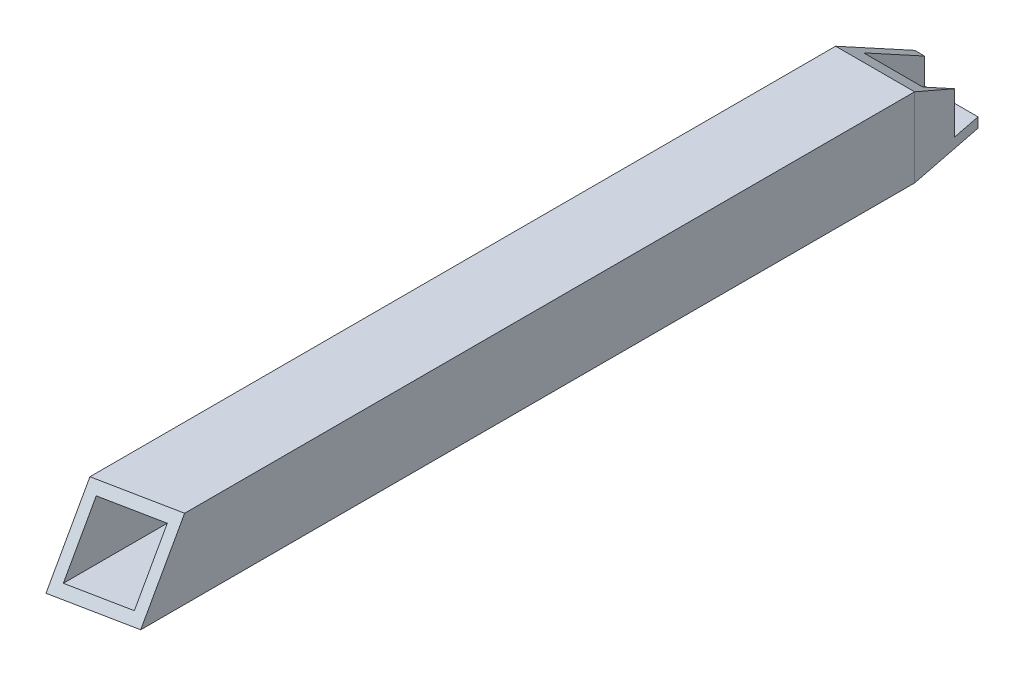
ISO-10303-21;
HEADER;
FILE_DESCRIPTION(('STEP AP214'),'2;1');
FILE_NAME('part.step','',(''),(''),'','','');
FILE_SCHEMA(('AUTOMOTIVE_DESIGN { 1 0 10303 214 1 1 1 1 }'));
ENDSEC;
DATA;
#1=APPLICATION_CONTEXT('core data for automotive mechanical design processes');
#2=APPLICATION_PROTOCOL_DEFINITION('international standard','automotive_design',2000,#1);
#3=PRODUCT_CONTEXT('',#1,'mechanical');
#4=PRODUCT('Part','Part','',(#3));
#5=PRODUCT_RELATED_PRODUCT_CATEGORY('part','',(#4));
#6=PRODUCT_DEFINITION_FORMATION('','',#4);
#7=PRODUCT_DEFINITION_CONTEXT('part definition',#1,'design');
#8=PRODUCT_DEFINITION('design','',#6,#7);
#9=PRODUCT_DEFINITION_SHAPE('','',#8);
#10=(LENGTH_UNIT() NAMED_UNIT(*) SI_UNIT(.MILLI.,.METRE.));
#11=(NAMED_UNIT(*) PLANE_ANGLE_UNIT() SI_UNIT($,.RADIAN.));
#12=(NAMED_UNIT(*) SI_UNIT($,.STERADIAN.) SOLID_ANGLE_UNIT());
#13=UNCERTAINTY_MEASURE_WITH_UNIT(LENGTH_MEASURE(1.E-05),#10,'distance_accuracy_value','');
#14=(GEOMETRIC_REPRESENTATION_CONTEXT(3) GLOBAL_UNCERTAINTY_ASSIGNED_CONTEXT((#13)) GLOBAL_UNIT_ASSIGNED_CONTEXT((#10,
#11,#12)) REPRESENTATION_CONTEXT('',''));
#15=CARTESIAN_POINT('',(0.,0.,0.));
#16=DIRECTION('',(0.,0.,1.));
#17=DIRECTION('',(1.,0.,0.));
#18=AXIS2_PLACEMENT_3D('',#15,#16,#17);
#19=CARTESIAN_POINT('',(12.7,-12.7,139.7));
#20=DIRECTION('',(-1.,0.,0.));
#21=DIRECTION('',(0.,0.,1.));
#22=AXIS2_PLACEMENT_3D('',#19,#20,#21);
#23=PLANE('',#22);
#24=DIRECTION('',(0.,-0.478845087585913,-0.877899414565723));
#25=VECTOR('',#24,1.);
#26=CARTESIAN_POINT('',(12.7,113.632615657703,70.7926156164541));
#27=LINE('',#26,#25);
#28=CARTESIAN_POINT('',(12.7,12.7,-114.254044553338));
#29=VERTEX_POINT('',#28);
#30=CARTESIAN_POINT('',(12.7,12.6749338711053,-114.3));
#31=VERTEX_POINT('',#30);
#32=EDGE_CURVE('E58',#29,#31,#27,.T.);
#33=ORIENTED_EDGE('',*,*,#32,.F.);
#34=DIRECTION('',(0.,0.,-1.));
#35=VECTOR('',#34,1.);
#36=CARTESIAN_POINT('',(12.7,12.7,139.7));
#37=LINE('',#36,#35);
#38=CARTESIAN_POINT('',(12.7,12.7,120.516824075556));
#39=VERTEX_POINT('',#38);
#40=EDGE_CURVE('E216',#39,#29,#37,.T.);
#41=ORIENTED_EDGE('',*,*,#40,.F.);
#42=DIRECTION('',(0.,0.873936887721125,-0.486039418442901));
#43=VECTOR('',#42,1.);
#44=CARTESIAN_POINT('',(12.7,-14.8480433532563,135.837650051412));
#45=LINE('',#44,#43);
#46=CARTESIAN_POINT('',(12.7,-12.7,134.643017170164));
#47=VERTEX_POINT('',#46);
#48=EDGE_CURVE('E173',#47,#39,#45,.T.);
#49=ORIENTED_EDGE('',*,*,#48,.F.);
#50=DIRECTION('',(0.,0.,-1.));
#51=VECTOR('',#50,1.);
#52=CARTESIAN_POINT('',(12.7,-12.7,139.7));
#53=LINE('',#52,#51);
#54=CARTESIAN_POINT('',(12.7,-12.7,-114.3));
#55=VERTEX_POINT('',#54);
#56=EDGE_CURVE('E220',#47,#55,#53,.T.);
#57=ORIENTED_EDGE('',*,*,#56,.T.);
#58=DIRECTION('',(0.,-1.,0.));
#59=VECTOR('',#58,1.);
#60=CARTESIAN_POINT('',(12.7,-12.7,-114.3));
#61=LINE('',#60,#59);
#62=EDGE_CURVE('E64',#31,#55,#61,.T.);
#63=ORIENTED_EDGE('',*,*,#62,.F.);
#64=EDGE_LOOP('',(#33,#41,#49,#57,#63));
#65=FACE_BOUND('',#64,.T.);
#66=ADVANCED_FACE('F42',(#65),#23,.F.);
#67=CARTESIAN_POINT('',(12.7,12.7,139.7));
#68=DIRECTION('',(0.,-1.,0.));
#69=DIRECTION('',(0.,0.,-1.));
#70=AXIS2_PLACEMENT_3D('',#67,#68,#69);
#71=PLANE('',#70);
#72=DIRECTION('',(1.,0.,0.));
#73=VECTOR('',#72,1.);
#74=CARTESIAN_POINT('',(12.7,12.7,-114.254044553338));
#75=LINE('',#74,#73);
#76=CARTESIAN_POINT('',(-12.7,12.7,-114.254044553338));
#77=VERTEX_POINT('',#76);
#78=EDGE_CURVE('E256',#77,#29,#75,.T.);
#79=ORIENTED_EDGE('',*,*,#78,.F.);
#80=DIRECTION('',(0.,0.,-1.));
#81=VECTOR('',#80,1.);
#82=CARTESIAN_POINT('',(-12.7,12.7,139.7));
#83=LINE('',#82,#81);
#84=CARTESIAN_POINT('',(-12.7,12.7,125.573806905392));
#85=VERTEX_POINT('',#84);
#86=EDGE_CURVE('E212',#85,#77,#83,.T.);
#87=ORIENTED_EDGE('',*,*,#86,.F.);
#88=DIRECTION('',(-0.98075121578061,0.,0.195261498367845));
#89=VECTOR('',#88,1.);
#90=CARTESIAN_POINT('',(9.0263651832796,12.7,121.248222035841));
#91=LINE('',#90,#89);
#92=EDGE_CURVE('E169',#39,#85,#91,.T.);
#93=ORIENTED_EDGE('',*,*,#92,.F.);
#94=ORIENTED_EDGE('',*,*,#40,.T.);
#95=EDGE_LOOP('',(#79,#87,#93,#94));
#96=FACE_BOUND('',#95,.T.);
#97=ADVANCED_FACE('F250',(#96),#71,.F.);
#98=CARTESIAN_POINT('',(9.525,-9.525,139.7));
#99=DIRECTION('',(-1.,0.,0.));
#100=DIRECTION('',(0.,0.,1.));
#101=AXIS2_PLACEMENT_3D('',#98,#99,#100);
#102=PLANE('',#101);
#103=DIRECTION('',(0.,0.,-1.));
#104=VECTOR('',#103,1.);
#105=CARTESIAN_POINT('',(9.525,9.525,139.7));
#106=LINE('',#105,#104);
#107=CARTESIAN_POINT('',(9.525,9.525,122.914721066111));
#108=VERTEX_POINT('',#107);
#109=CARTESIAN_POINT('',(9.525,9.52500000000002,-120.074988974629));
#110=VERTEX_POINT('',#109);
#111=EDGE_CURVE('E136',#108,#110,#106,.T.);
#112=ORIENTED_EDGE('',*,*,#111,.T.);
#113=DIRECTION('',(0.,-0.478845087585913,-0.877899414565723));
#114=VECTOR('',#113,1.);
#115=CARTESIAN_POINT('',(9.525,114.360619719552,72.1273152014925));
#116=LINE('',#115,#114);
#117=CARTESIAN_POINT('',(9.525,3.97659657792252,-130.247256044493));
#118=VERTEX_POINT('',#117);
#119=EDGE_CURVE('E125',#110,#118,#116,.T.);
#120=ORIENTED_EDGE('',*,*,#119,.T.);
#121=DIRECTION('',(0.,-1.,0.));
#122=VECTOR('',#121,1.);
#123=CARTESIAN_POINT('',(9.525,-9.525,-130.247256044493));
#124=LINE('',#123,#122);
#125=CARTESIAN_POINT('',(9.525,-9.525,-130.247256044493));
#126=VERTEX_POINT('',#125);
#127=EDGE_CURVE('E132',#118,#126,#124,.T.);
#128=ORIENTED_EDGE('',*,*,#127,.T.);
#129=DIRECTION('',(0.,0.,-1.));
#130=VECTOR('',#129,1.);
#131=CARTESIAN_POINT('',(9.525,-9.525,139.7));
#132=LINE('',#131,#130);
#133=CARTESIAN_POINT('',(9.525,-9.525,133.509365887067));
#134=VERTEX_POINT('',#133);
#135=EDGE_CURVE('E205',#134,#126,#132,.T.);
#136=ORIENTED_EDGE('',*,*,#135,.F.);
#137=DIRECTION('',(0.,0.873936887721125,-0.486039418442901));
#138=VECTOR('',#137,1.);
#139=CARTESIAN_POINT('',(9.525,-12.1545818882893,134.971806104078));
#140=LINE('',#139,#138);
#141=EDGE_CURVE('E158',#134,#108,#140,.T.);
#142=ORIENTED_EDGE('',*,*,#141,.T.);
#143=EDGE_LOOP('',(#112,#120,#128,#136,#142));
#144=FACE_BOUND('',#143,.T.);
#145=ADVANCED_FACE('F130',(#144),#102,.T.);
#146=CARTESIAN_POINT('',(9.525,9.525,139.7));
#147=DIRECTION('',(0.,-1.,0.));
#148=DIRECTION('',(0.,0.,-1.));
#149=AXIS2_PLACEMENT_3D('',#146,#147,#148);
#150=PLANE('',#149);
#151=DIRECTION('',(0.,0.,-1.));
#152=VECTOR('',#151,1.);
#153=CARTESIAN_POINT('',(-9.52499999999999,9.525,139.7));
#154=LINE('',#153,#152);
#155=CARTESIAN_POINT('',(-9.52499999999999,9.525,126.707458188488));
#156=VERTEX_POINT('',#155);
#157=CARTESIAN_POINT('',(-9.52499999999999,9.525,-120.074988974629));
#158=VERTEX_POINT('',#157);
#159=EDGE_CURVE('E199',#156,#158,#154,.T.);
#160=ORIENTED_EDGE('',*,*,#159,.T.);
#161=DIRECTION('',(1.,0.,0.));
#162=VECTOR('',#161,1.);
#163=CARTESIAN_POINT('',(9.525,9.525,-120.074988974629));
#164=LINE('',#163,#162);
#165=EDGE_CURVE('E253',#158,#110,#164,.T.);
#166=ORIENTED_EDGE('',*,*,#165,.T.);
#167=ORIENTED_EDGE('',*,*,#111,.F.);
#168=DIRECTION('',(-0.98075121578061,0.,0.195261498367845));
#169=VECTOR('',#168,1.);
#170=CARTESIAN_POINT('',(6.31056953536965,9.525,123.554694281361));
#171=LINE('',#170,#169);
#172=EDGE_CURVE('E228',#108,#156,#171,.T.);
#173=ORIENTED_EDGE('',*,*,#172,.T.);
#174=EDGE_LOOP('',(#160,#166,#167,#173));
#175=FACE_BOUND('',#174,.T.);
#176=ADVANCED_FACE('F274',(#175),#150,.T.);
#177=CARTESIAN_POINT('',(0.,0.,-139.7));
#178=DIRECTION('',(0.,0.,1.));
#179=DIRECTION('',(1.,0.,0.));
#180=AXIS2_PLACEMENT_3D('',#177,#178,#179);
#181=PLANE('',#180);
#182=DIRECTION('',(-1.,0.,0.));
#183=VECTOR('',#182,1.);
#184=CARTESIAN_POINT('',(0.,-1.1793471807835,-139.7));
#185=LINE('',#184,#183);
#186=CARTESIAN_POINT('',(-9.52499999999999,-1.1793471807835,-139.7));
#187=VERTEX_POINT('',#186);
#188=CARTESIAN_POINT('',(-12.7,-1.1793471807835,-139.7));
#189=VERTEX_POINT('',#188);
#190=EDGE_CURVE('E144',#187,#189,#185,.T.);
#191=ORIENTED_EDGE('',*,*,#190,.F.);
#192=DIRECTION('',(0.,-1.,0.));
#193=VECTOR('',#192,1.);
#194=CARTESIAN_POINT('',(-9.52499999999999,-9.525,-139.7));
#195=LINE('',#194,#193);
#196=CARTESIAN_POINT('',(-9.52499999999999,-9.525,-139.7));
#197=VERTEX_POINT('',#196);
#198=EDGE_CURVE('E185',#187,#197,#195,.T.);
#199=ORIENTED_EDGE('',*,*,#198,.T.);
#200=DIRECTION('',(1.,0.,0.));
#201=VECTOR('',#200,1.);
#202=CARTESIAN_POINT('',(9.525,-9.525,-139.7));
#203=LINE('',#202,#201);
#204=CARTESIAN_POINT('',(7.64301717016406,-9.525,-139.7));
#205=VERTEX_POINT('',#204);
#206=EDGE_CURVE('E188',#197,#205,#203,.T.);
#207=ORIENTED_EDGE('',*,*,#206,.T.);
#208=DIRECTION('',(0.,1.,0.));
#209=VECTOR('',#208,1.);
#210=CARTESIAN_POINT('',(7.64301717016406,0.,-139.7));
#211=LINE('',#210,#209);
#212=CARTESIAN_POINT('',(7.64301717016406,-12.7,-139.7));
#213=VERTEX_POINT('',#212);
#214=EDGE_CURVE('E51',#213,#205,#211,.T.);
#215=ORIENTED_EDGE('',*,*,#214,.F.);
#216=DIRECTION('',(1.,0.,0.));
#217=VECTOR('',#216,1.);
#218=CARTESIAN_POINT('',(12.7,-12.7,-139.7));
#219=LINE('',#218,#217);
#220=CARTESIAN_POINT('',(-12.7,-12.7,-139.7));
#221=VERTEX_POINT('',#220);
#222=EDGE_CURVE('E195',#221,#213,#219,.T.);
#223=ORIENTED_EDGE('',*,*,#222,.F.);
#224=DIRECTION('',(0.,-1.,0.));
#225=VECTOR('',#224,1.);
#226=CARTESIAN_POINT('',(-12.7,-12.7,-139.7));
#227=LINE('',#226,#225);
#228=EDGE_CURVE('E192',#189,#221,#227,.T.);
#229=ORIENTED_EDGE('',*,*,#228,.F.);
#230=EDGE_LOOP('',(#191,#199,#207,#215,#223,#229));
#231=FACE_BOUND('',#230,.T.);
#232=ADVANCED_FACE('F235',(#231),#181,.F.);
#233=CARTESIAN_POINT('',(-12.7,-12.7,139.7));
#234=DIRECTION('',(1.,0.,0.));
#235=DIRECTION('',(0.,0.,-1.));
#236=AXIS2_PLACEMENT_3D('',#233,#234,#235);
#237=PLANE('',#236);
#238=DIRECTION('',(0.,0.478845087585913,0.877899414565723));
#239=VECTOR('',#238,1.);
#240=CARTESIAN_POINT('',(-12.7,113.632615657703,70.7926156164541));
#241=LINE('',#240,#239);
#242=EDGE_CURVE('E149',#189,#77,#241,.T.);
#243=ORIENTED_EDGE('',*,*,#242,.F.);
#244=ORIENTED_EDGE('',*,*,#228,.T.);
#245=DIRECTION('',(0.,0.,-1.));
#246=VECTOR('',#245,1.);
#247=CARTESIAN_POINT('',(-12.7,-12.7,139.7));
#248=LINE('',#247,#246);
#249=CARTESIAN_POINT('',(-12.7,-12.7,139.7));
#250=VERTEX_POINT('',#249);
#251=EDGE_CURVE('E224',#250,#221,#248,.T.);
#252=ORIENTED_EDGE('',*,*,#251,.F.);
#253=DIRECTION('',(0.,-0.873936887721125,0.486039418442901));
#254=VECTOR('',#253,1.);
#255=CARTESIAN_POINT('',(-12.7,-12.7,139.7));
#256=LINE('',#255,#254);
#257=EDGE_CURVE('E181',#85,#250,#256,.T.);
#258=ORIENTED_EDGE('',*,*,#257,.F.);
#259=ORIENTED_EDGE('',*,*,#86,.T.);
#260=EDGE_LOOP('',(#243,#244,#252,#258,#259));
#261=FACE_BOUND('',#260,.T.);
#262=ADVANCED_FACE('F44',(#261),#237,.F.);
#263=CARTESIAN_POINT('',(-9.52499999999999,-9.525,139.7));
#264=DIRECTION('',(1.,0.,0.));
#265=DIRECTION('',(0.,0.,-1.));
#266=AXIS2_PLACEMENT_3D('',#263,#264,#265);
#267=PLANE('',#266);
#268=ORIENTED_EDGE('',*,*,#198,.F.);
#269=DIRECTION('',(0.,0.478845087585913,0.877899414565723));
#270=VECTOR('',#269,1.);
#271=CARTESIAN_POINT('',(-9.52499999999999,114.360619719552,72.1273152014925));
#272=LINE('',#271,#270);
#273=EDGE_CURVE('E261',#187,#158,#272,.T.);
#274=ORIENTED_EDGE('',*,*,#273,.T.);
#275=ORIENTED_EDGE('',*,*,#159,.F.);
#276=DIRECTION('',(0.,-0.873936887721125,0.486039418442901));
#277=VECTOR('',#276,1.);
#278=CARTESIAN_POINT('',(-9.52499999999999,-10.543549373347,137.868568565519));
#279=LINE('',#278,#277);
#280=CARTESIAN_POINT('',(-9.525,-9.525,137.302103009444));
#281=VERTEX_POINT('',#280);
#282=EDGE_CURVE('E165',#156,#281,#279,.T.);
#283=ORIENTED_EDGE('',*,*,#282,.T.);
#284=DIRECTION('',(0.,0.,-1.));
#285=VECTOR('',#284,1.);
#286=CARTESIAN_POINT('',(-9.52499999999999,-9.525,139.7));
#287=LINE('',#286,#285);
#288=EDGE_CURVE('E208',#281,#197,#287,.T.);
#289=ORIENTED_EDGE('',*,*,#288,.T.);
#290=EDGE_LOOP('',(#268,#274,#275,#283,#289));
#291=FACE_BOUND('',#290,.T.);
#292=ADVANCED_FACE('F267',(#291),#267,.T.);
#293=CARTESIAN_POINT('',(34.1045738345287,0.,-6.79000961811353));
#294=DIRECTION('',(0.98075121578061,0.,-0.195261498367845));
#295=DIRECTION('',(-0.195261498367845,0.,-0.98075121578061));
#296=AXIS2_PLACEMENT_3D('',#293,#294,#295);
#297=PLANE('',#296);
#298=ORIENTED_EDGE('',*,*,#127,.F.);
#299=DIRECTION('',(0.172174202287175,0.471694262890875,0.86478931909605));
#300=VECTOR('',#299,1.);
#301=CARTESIAN_POINT('',(28.3127761559501,55.4482230324959,-35.8808066380174));
#302=LINE('',#301,#300);
#303=EDGE_CURVE('E12',#118,#31,#302,.T.);
#304=ORIENTED_EDGE('',*,*,#303,.T.);
#305=ORIENTED_EDGE('',*,*,#62,.T.);
#306=DIRECTION('',(-0.195261498367845,0.,-0.98075121578061));
#307=VECTOR('',#306,1.);
#308=CARTESIAN_POINT('',(61.3417497875296,-12.7,130.015728602807));
#309=LINE('',#308,#307);
#310=EDGE_CURVE('E155',#55,#213,#309,.T.);
#311=ORIENTED_EDGE('',*,*,#310,.T.);
#312=ORIENTED_EDGE('',*,*,#214,.T.);
#313=DIRECTION('',(-0.195261498367845,0.,-0.98075121578061));
#314=VECTOR('',#313,1.);
#315=CARTESIAN_POINT('',(61.2206963950647,-9.525,129.407706730462));
#316=LINE('',#315,#314);
#317=EDGE_CURVE('E142',#126,#205,#316,.T.);
#318=ORIENTED_EDGE('',*,*,#317,.F.);
#319=EDGE_LOOP('',(#298,#304,#305,#311,#312,#318));
#320=FACE_BOUND('',#319,.T.);
#321=ADVANCED_FACE('F140',(#320),#297,.T.);
#322=CARTESIAN_POINT('',(12.7,-12.7,139.7));
#323=DIRECTION('',(0.,1.,0.));
#324=DIRECTION('',(0.,0.,1.));
#325=AXIS2_PLACEMENT_3D('',#322,#323,#324);
#326=PLANE('',#325);
#327=ORIENTED_EDGE('',*,*,#310,.F.);
#328=ORIENTED_EDGE('',*,*,#56,.F.);
#329=DIRECTION('',(0.98075121578061,0.,-0.195261498367845));
#330=VECTOR('',#329,1.);
#331=CARTESIAN_POINT('',(11.7315728602807,-12.7,134.835825021247));
#332=LINE('',#331,#330);
#333=EDGE_CURVE('E177',#250,#47,#332,.T.);
#334=ORIENTED_EDGE('',*,*,#333,.F.);
#335=ORIENTED_EDGE('',*,*,#251,.T.);
#336=ORIENTED_EDGE('',*,*,#222,.T.);
#337=EDGE_LOOP('',(#327,#328,#334,#335,#336));
#338=FACE_BOUND('',#337,.T.);
#339=ADVANCED_FACE('F239',(#338),#326,.F.);
#340=CARTESIAN_POINT('',(9.525,-9.525,139.7));
#341=DIRECTION('',(0.,1.,0.));
#342=DIRECTION('',(0.,0.,1.));
#343=AXIS2_PLACEMENT_3D('',#340,#341,#342);
#344=PLANE('',#343);
#345=ORIENTED_EDGE('',*,*,#135,.T.);
#346=ORIENTED_EDGE('',*,*,#317,.T.);
#347=ORIENTED_EDGE('',*,*,#206,.F.);
#348=ORIENTED_EDGE('',*,*,#288,.F.);
#349=DIRECTION('',(0.98075121578061,0.,-0.195261498367845));
#350=VECTOR('',#349,1.);
#351=CARTESIAN_POINT('',(8.33947529312044,-9.525,133.745396520415));
#352=LINE('',#351,#350);
#353=EDGE_CURVE('E161',#281,#134,#352,.T.);
#354=ORIENTED_EDGE('',*,*,#353,.T.);
#355=EDGE_LOOP('',(#345,#346,#347,#348,#354));
#356=FACE_BOUND('',#355,.T.);
#357=ADVANCED_FACE('F271',(#356),#344,.T.);
#358=CARTESIAN_POINT('',(19.203056865409,53.6418845812678,96.4523038329581));
#359=DIRECTION('',(0.171419955104357,0.478845087585913,0.861000918168419));
#360=DIRECTION('',(0.,-0.873936887721125,0.486039418442901));
#361=AXIS2_PLACEMENT_3D('',#358,#359,#360);
#362=PLANE('',#361);
#363=ORIENTED_EDGE('',*,*,#282,.F.);
#364=ORIENTED_EDGE('',*,*,#172,.F.);
#365=ORIENTED_EDGE('',*,*,#141,.F.);
#366=ORIENTED_EDGE('',*,*,#353,.F.);
#367=EDGE_LOOP('',(#363,#364,#365,#366));
#368=FACE_BOUND('',#367,.T.);
#369=ORIENTED_EDGE('',*,*,#92,.T.);
#370=ORIENTED_EDGE('',*,*,#257,.T.);
#371=ORIENTED_EDGE('',*,*,#333,.T.);
#372=ORIENTED_EDGE('',*,*,#48,.T.);
#373=EDGE_LOOP('',(#369,#370,#371,#372));
#374=FACE_BOUND('',#373,.T.);
#375=ADVANCED_FACE('F246',(#368,#374),#362,.T.);
#376=CARTESIAN_POINT('',(0.,57.817850163408,-31.5364073220413));
#377=DIRECTION('',(0.,0.877899414565723,-0.478845087585913));
#378=DIRECTION('',(0.,0.478845087585913,0.877899414565723));
#379=AXIS2_PLACEMENT_3D('',#376,#377,#378);
#380=PLANE('',#379);
#381=ORIENTED_EDGE('',*,*,#273,.F.);
#382=ORIENTED_EDGE('',*,*,#190,.T.);
#383=ORIENTED_EDGE('',*,*,#242,.T.);
#384=ORIENTED_EDGE('',*,*,#78,.T.);
#385=ORIENTED_EDGE('',*,*,#32,.T.);
#386=ORIENTED_EDGE('',*,*,#303,.F.);
#387=ORIENTED_EDGE('',*,*,#119,.F.);
#388=ORIENTED_EDGE('',*,*,#165,.F.);
#389=EDGE_LOOP('',(#381,#382,#383,#384,#385,#386,#387,#388));
#390=FACE_BOUND('',#389,.T.);
#391=ADVANCED_FACE('F124',(#390),#380,.T.);
#392=CLOSED_SHELL('',(#66,#97,#145,#176,#232,#262,#292,#321,#339,#357,#375,#391));
#393=MANIFOLD_SOLID_BREP('B2',#392);
#394=ADVANCED_BREP_SHAPE_REPRESENTATION('',(#18,#393),#14);
#395=SHAPE_DEFINITION_REPRESENTATION(#9,#394);
ENDSEC;
END-ISO-10303-21;
